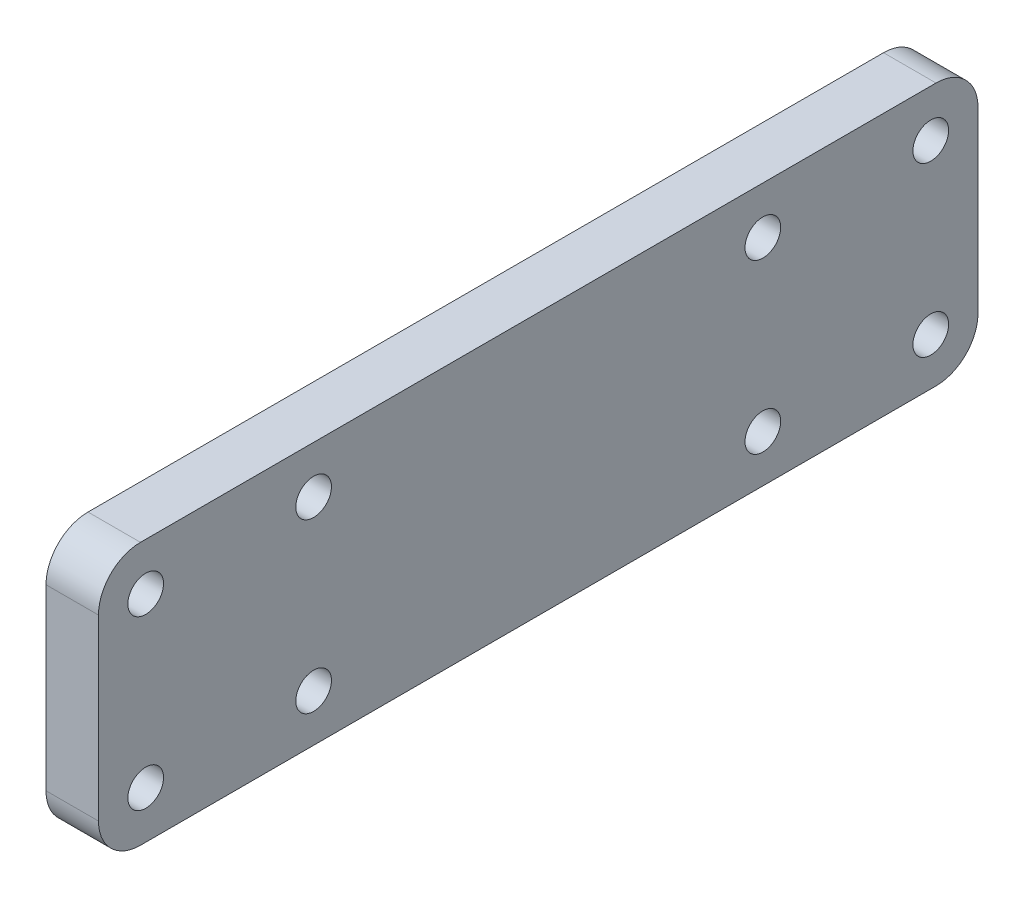
ISO-10303-21;
HEADER;
FILE_DESCRIPTION(('STEP AP214'),'2;1');
FILE_NAME('part.step','',(''),(''),'','','');
FILE_SCHEMA(('AUTOMOTIVE_DESIGN { 1 0 10303 214 1 1 1 1 }'));
ENDSEC;
DATA;
#1=APPLICATION_CONTEXT('core data for automotive mechanical design processes');
#2=APPLICATION_PROTOCOL_DEFINITION('international standard','automotive_design',2000,#1);
#3=PRODUCT_CONTEXT('',#1,'mechanical');
#4=PRODUCT('Part','Part','',(#3));
#5=PRODUCT_RELATED_PRODUCT_CATEGORY('part','',(#4));
#6=PRODUCT_DEFINITION_FORMATION('','',#4);
#7=PRODUCT_DEFINITION_CONTEXT('part definition',#1,'design');
#8=PRODUCT_DEFINITION('design','',#6,#7);
#9=PRODUCT_DEFINITION_SHAPE('','',#8);
#10=(LENGTH_UNIT() NAMED_UNIT(*) SI_UNIT(.MILLI.,.METRE.));
#11=(NAMED_UNIT(*) PLANE_ANGLE_UNIT() SI_UNIT($,.RADIAN.));
#12=(NAMED_UNIT(*) SI_UNIT($,.STERADIAN.) SOLID_ANGLE_UNIT());
#13=UNCERTAINTY_MEASURE_WITH_UNIT(LENGTH_MEASURE(1.E-05),#10,'distance_accuracy_value','');
#14=(GEOMETRIC_REPRESENTATION_CONTEXT(3) GLOBAL_UNCERTAINTY_ASSIGNED_CONTEXT((#13)) GLOBAL_UNIT_ASSIGNED_CONTEXT((#10,
#11,#12)) REPRESENTATION_CONTEXT('',''));
#15=CARTESIAN_POINT('',(0.,0.,0.));
#16=DIRECTION('',(0.,0.,1.));
#17=DIRECTION('',(1.,0.,0.));
#18=AXIS2_PLACEMENT_3D('',#15,#16,#17);
#19=CARTESIAN_POINT('',(5.,12.5,83.80285333));
#20=DIRECTION('',(0.,-1.,0.));
#21=DIRECTION('',(0.,0.,-1.));
#22=AXIS2_PLACEMENT_3D('',#19,#20,#21);
#23=PLANE('',#22);
#24=DIRECTION('',(0.,0.,-1.));
#25=VECTOR('',#24,1.);
#26=CARTESIAN_POINT('',(0.,12.5,83.80285333));
#27=LINE('',#26,#25);
#28=CARTESIAN_POINT('',(0.,12.5,79.80285333));
#29=VERTEX_POINT('',#28);
#30=CARTESIAN_POINT('',(0.,12.5,4.));
#31=VERTEX_POINT('',#30);
#32=EDGE_CURVE('E116',#29,#31,#27,.T.);
#33=ORIENTED_EDGE('',*,*,#32,.F.);
#34=DIRECTION('',(-1.,0.,0.));
#35=VECTOR('',#34,1.);
#36=CARTESIAN_POINT('',(5.,12.5,79.80285333));
#37=LINE('',#36,#35);
#38=CARTESIAN_POINT('',(5.,12.5,79.80285333));
#39=VERTEX_POINT('',#38);
#40=EDGE_CURVE('E102',#29,#39,#37,.F.);
#41=ORIENTED_EDGE('',*,*,#40,.T.);
#42=DIRECTION('',(0.,0.,-1.));
#43=VECTOR('',#42,1.);
#44=CARTESIAN_POINT('',(5.,12.5,83.80285333));
#45=LINE('',#44,#43);
#46=CARTESIAN_POINT('',(5.,12.5,4.));
#47=VERTEX_POINT('',#46);
#48=EDGE_CURVE('E123',#39,#47,#45,.T.);
#49=ORIENTED_EDGE('',*,*,#48,.T.);
#50=DIRECTION('',(-1.,0.,0.));
#51=VECTOR('',#50,1.);
#52=CARTESIAN_POINT('',(5.,12.5,4.));
#53=LINE('',#52,#51);
#54=EDGE_CURVE('E160',#47,#31,#53,.T.);
#55=ORIENTED_EDGE('',*,*,#54,.T.);
#56=EDGE_LOOP('',(#33,#41,#49,#55));
#57=FACE_BOUND('',#56,.T.);
#58=ADVANCED_FACE('F32',(#57),#23,.F.);
#59=CARTESIAN_POINT('',(0.,12.5,83.80285333));
#60=DIRECTION('',(1.,0.,0.));
#61=DIRECTION('',(0.,0.,-1.));
#62=AXIS2_PLACEMENT_3D('',#59,#60,#61);
#63=PLANE('',#62);
#64=CARTESIAN_POINT('',(0.,-8.00000000000001,4.5));
#65=DIRECTION('',(1.,0.,0.));
#66=DIRECTION('',(0.,0.,-1.));
#67=AXIS2_PLACEMENT_3D('',#64,#65,#66);
#68=CIRCLE('',#67,1.7);
#69=CARTESIAN_POINT('',(0.,-8.00000000000001,2.80000000000001));
#70=VERTEX_POINT('',#69);
#71=EDGE_CURVE('E241',#70,#70,#68,.T.);
#72=ORIENTED_EDGE('',*,*,#71,.T.);
#73=EDGE_LOOP('',(#72));
#74=FACE_BOUND('',#73,.T.);
#75=CARTESIAN_POINT('',(0.,8.00000000000001,4.5));
#76=DIRECTION('',(1.,0.,0.));
#77=DIRECTION('',(0.,0.,-1.));
#78=AXIS2_PLACEMENT_3D('',#75,#76,#77);
#79=CIRCLE('',#78,1.7);
#80=CARTESIAN_POINT('',(0.,8.00000000000001,2.80000000000001));
#81=VERTEX_POINT('',#80);
#82=EDGE_CURVE('E251',#81,#81,#79,.T.);
#83=ORIENTED_EDGE('',*,*,#82,.T.);
#84=EDGE_LOOP('',(#83));
#85=FACE_BOUND('',#84,.T.);
#86=CARTESIAN_POINT('',(0.,8.00000000000001,20.5));
#87=DIRECTION('',(1.,0.,0.));
#88=DIRECTION('',(0.,0.,-1.));
#89=AXIS2_PLACEMENT_3D('',#86,#87,#88);
#90=CIRCLE('',#89,1.7);
#91=CARTESIAN_POINT('',(0.,8.00000000000001,18.8));
#92=VERTEX_POINT('',#91);
#93=EDGE_CURVE('E257',#92,#92,#90,.T.);
#94=ORIENTED_EDGE('',*,*,#93,.T.);
#95=EDGE_LOOP('',(#94));
#96=FACE_BOUND('',#95,.T.);
#97=CARTESIAN_POINT('',(0.,8.00000000000001,63.30285333));
#98=DIRECTION('',(1.,0.,0.));
#99=DIRECTION('',(0.,0.,-1.));
#100=AXIS2_PLACEMENT_3D('',#97,#98,#99);
#101=CIRCLE('',#100,1.7);
#102=CARTESIAN_POINT('',(0.,8.00000000000001,61.60285333));
#103=VERTEX_POINT('',#102);
#104=EDGE_CURVE('E263',#103,#103,#101,.T.);
#105=ORIENTED_EDGE('',*,*,#104,.T.);
#106=EDGE_LOOP('',(#105));
#107=FACE_BOUND('',#106,.T.);
#108=CARTESIAN_POINT('',(0.,8.00000000000001,79.30285333));
#109=DIRECTION('',(1.,0.,0.));
#110=DIRECTION('',(0.,0.,-1.));
#111=AXIS2_PLACEMENT_3D('',#108,#109,#110);
#112=CIRCLE('',#111,1.7);
#113=CARTESIAN_POINT('',(0.,8.00000000000001,77.60285333));
#114=VERTEX_POINT('',#113);
#115=EDGE_CURVE('E269',#114,#114,#112,.T.);
#116=ORIENTED_EDGE('',*,*,#115,.T.);
#117=EDGE_LOOP('',(#116));
#118=FACE_BOUND('',#117,.T.);
#119=CARTESIAN_POINT('',(0.,-8.00000000000001,79.30285333));
#120=DIRECTION('',(1.,0.,0.));
#121=DIRECTION('',(0.,0.,-1.));
#122=AXIS2_PLACEMENT_3D('',#119,#120,#121);
#123=CIRCLE('',#122,1.7);
#124=CARTESIAN_POINT('',(0.,-8.00000000000001,77.60285333));
#125=VERTEX_POINT('',#124);
#126=EDGE_CURVE('E275',#125,#125,#123,.T.);
#127=ORIENTED_EDGE('',*,*,#126,.T.);
#128=EDGE_LOOP('',(#127));
#129=FACE_BOUND('',#128,.T.);
#130=CARTESIAN_POINT('',(0.,-8.00000000000001,63.30285333));
#131=DIRECTION('',(1.,0.,0.));
#132=DIRECTION('',(0.,0.,-1.));
#133=AXIS2_PLACEMENT_3D('',#130,#131,#132);
#134=CIRCLE('',#133,1.7);
#135=CARTESIAN_POINT('',(0.,-8.00000000000001,61.60285333));
#136=VERTEX_POINT('',#135);
#137=EDGE_CURVE('E281',#136,#136,#134,.T.);
#138=ORIENTED_EDGE('',*,*,#137,.T.);
#139=EDGE_LOOP('',(#138));
#140=FACE_BOUND('',#139,.T.);
#141=CARTESIAN_POINT('',(0.,-8.00000000000001,20.5));
#142=DIRECTION('',(1.,0.,0.));
#143=DIRECTION('',(0.,0.,-1.));
#144=AXIS2_PLACEMENT_3D('',#141,#142,#143);
#145=CIRCLE('',#144,1.7);
#146=CARTESIAN_POINT('',(0.,-8.00000000000001,18.8));
#147=VERTEX_POINT('',#146);
#148=EDGE_CURVE('E129',#147,#147,#145,.T.);
#149=ORIENTED_EDGE('',*,*,#148,.T.);
#150=EDGE_LOOP('',(#149));
#151=FACE_BOUND('',#150,.T.);
#152=DIRECTION('',(0.,0.,-1.));
#153=VECTOR('',#152,1.);
#154=CARTESIAN_POINT('',(0.,-12.5,83.80285333));
#155=LINE('',#154,#153);
#156=CARTESIAN_POINT('',(0.,-12.5,79.80285333));
#157=VERTEX_POINT('',#156);
#158=CARTESIAN_POINT('',(0.,-12.5,4.));
#159=VERTEX_POINT('',#158);
#160=EDGE_CURVE('E139',#157,#159,#155,.T.);
#161=ORIENTED_EDGE('',*,*,#160,.F.);
#162=CARTESIAN_POINT('',(0.,-8.50000000000001,79.80285333));
#163=DIRECTION('',(1.,0.,0.));
#164=DIRECTION('',(0.,0.,-1.));
#165=AXIS2_PLACEMENT_3D('',#162,#163,#164);
#166=CIRCLE('',#165,4.);
#167=CARTESIAN_POINT('',(0.,-8.50000000000001,83.80285333));
#168=VERTEX_POINT('',#167);
#169=EDGE_CURVE('E103',#157,#168,#166,.F.);
#170=ORIENTED_EDGE('',*,*,#169,.T.);
#171=DIRECTION('',(0.,-1.,0.));
#172=VECTOR('',#171,1.);
#173=CARTESIAN_POINT('',(0.,12.5,83.80285333));
#174=LINE('',#173,#172);
#175=CARTESIAN_POINT('',(0.,8.50000000000001,83.80285333));
#176=VERTEX_POINT('',#175);
#177=EDGE_CURVE('E111',#176,#168,#174,.T.);
#178=ORIENTED_EDGE('',*,*,#177,.F.);
#179=CARTESIAN_POINT('',(0.,8.50000000000001,79.80285333));
#180=DIRECTION('',(1.,0.,0.));
#181=DIRECTION('',(0.,0.,-1.));
#182=AXIS2_PLACEMENT_3D('',#179,#180,#181);
#183=CIRCLE('',#182,4.);
#184=EDGE_CURVE('E55',#176,#29,#183,.F.);
#185=ORIENTED_EDGE('',*,*,#184,.T.);
#186=ORIENTED_EDGE('',*,*,#32,.T.);
#187=CARTESIAN_POINT('',(0.,8.50000000000001,4.));
#188=DIRECTION('',(1.,0.,0.));
#189=DIRECTION('',(0.,0.,-1.));
#190=AXIS2_PLACEMENT_3D('',#187,#188,#189);
#191=CIRCLE('',#190,4.);
#192=CARTESIAN_POINT('',(0.,8.50000000000001,0.));
#193=VERTEX_POINT('',#192);
#194=EDGE_CURVE('E47',#31,#193,#191,.F.);
#195=ORIENTED_EDGE('',*,*,#194,.T.);
#196=DIRECTION('',(0.,-1.,0.));
#197=VECTOR('',#196,1.);
#198=CARTESIAN_POINT('',(0.,12.5,0.));
#199=LINE('',#198,#197);
#200=CARTESIAN_POINT('',(0.,-8.50000000000001,0.));
#201=VERTEX_POINT('',#200);
#202=EDGE_CURVE('E126',#193,#201,#199,.T.);
#203=ORIENTED_EDGE('',*,*,#202,.T.);
#204=CARTESIAN_POINT('',(0.,-8.50000000000001,4.));
#205=DIRECTION('',(1.,0.,0.));
#206=DIRECTION('',(0.,0.,-1.));
#207=AXIS2_PLACEMENT_3D('',#204,#205,#206);
#208=CIRCLE('',#207,4.);
#209=EDGE_CURVE('E104',#201,#159,#208,.F.);
#210=ORIENTED_EDGE('',*,*,#209,.T.);
#211=EDGE_LOOP('',(#161,#170,#178,#185,#186,#195,#203,#210));
#212=FACE_BOUND('',#211,.T.);
#213=ADVANCED_FACE('F119',(#74,#85,#96,#107,#118,#129,#140,#151,#212),#63,.F.);
#214=CARTESIAN_POINT('',(0.,-12.5,83.80285333));
#215=DIRECTION('',(0.,1.,0.));
#216=DIRECTION('',(0.,0.,1.));
#217=AXIS2_PLACEMENT_3D('',#214,#215,#216);
#218=PLANE('',#217);
#219=DIRECTION('',(0.,0.,-1.));
#220=VECTOR('',#219,1.);
#221=CARTESIAN_POINT('',(5.,-12.5,83.80285333));
#222=LINE('',#221,#220);
#223=CARTESIAN_POINT('',(5.,-12.5,79.80285333));
#224=VERTEX_POINT('',#223);
#225=CARTESIAN_POINT('',(5.,-12.5,4.));
#226=VERTEX_POINT('',#225);
#227=EDGE_CURVE('E136',#224,#226,#222,.T.);
#228=ORIENTED_EDGE('',*,*,#227,.F.);
#229=DIRECTION('',(1.,0.,0.));
#230=VECTOR('',#229,1.);
#231=CARTESIAN_POINT('',(0.,-12.5,79.80285333));
#232=LINE('',#231,#230);
#233=EDGE_CURVE('E155',#224,#157,#232,.F.);
#234=ORIENTED_EDGE('',*,*,#233,.T.);
#235=ORIENTED_EDGE('',*,*,#160,.T.);
#236=DIRECTION('',(1.,0.,0.));
#237=VECTOR('',#236,1.);
#238=CARTESIAN_POINT('',(0.,-12.5,4.));
#239=LINE('',#238,#237);
#240=EDGE_CURVE('E152',#159,#226,#239,.T.);
#241=ORIENTED_EDGE('',*,*,#240,.T.);
#242=EDGE_LOOP('',(#228,#234,#235,#241));
#243=FACE_BOUND('',#242,.T.);
#244=ADVANCED_FACE('F178',(#243),#218,.F.);
#245=CARTESIAN_POINT('',(5.,-12.5,83.80285333));
#246=DIRECTION('',(-1.,0.,0.));
#247=DIRECTION('',(0.,0.,1.));
#248=AXIS2_PLACEMENT_3D('',#245,#246,#247);
#249=PLANE('',#248);
#250=CARTESIAN_POINT('',(5.00000000000001,-8.00000000000001,4.5));
#251=DIRECTION('',(1.,0.,0.));
#252=DIRECTION('',(0.,0.,-1.));
#253=AXIS2_PLACEMENT_3D('',#250,#251,#252);
#254=CIRCLE('',#253,1.69999999999999);
#255=CARTESIAN_POINT('',(5.00000000000001,-8.00000000000001,2.80000000000002));
#256=VERTEX_POINT('',#255);
#257=EDGE_CURVE('E244',#256,#256,#254,.T.);
#258=ORIENTED_EDGE('',*,*,#257,.F.);
#259=EDGE_LOOP('',(#258));
#260=FACE_BOUND('',#259,.T.);
#261=CARTESIAN_POINT('',(5.00000000000001,8.00000000000001,4.5));
#262=DIRECTION('',(1.,0.,0.));
#263=DIRECTION('',(0.,0.,-1.));
#264=AXIS2_PLACEMENT_3D('',#261,#262,#263);
#265=CIRCLE('',#264,1.69999999999999);
#266=CARTESIAN_POINT('',(5.00000000000001,8.00000000000001,2.80000000000002));
#267=VERTEX_POINT('',#266);
#268=EDGE_CURVE('E246',#267,#267,#265,.T.);
#269=ORIENTED_EDGE('',*,*,#268,.F.);
#270=EDGE_LOOP('',(#269));
#271=FACE_BOUND('',#270,.T.);
#272=CARTESIAN_POINT('',(5.00000000000001,8.00000000000001,20.5));
#273=DIRECTION('',(1.,0.,0.));
#274=DIRECTION('',(0.,0.,-1.));
#275=AXIS2_PLACEMENT_3D('',#272,#273,#274);
#276=CIRCLE('',#275,1.69999999999999);
#277=CARTESIAN_POINT('',(5.00000000000001,8.00000000000001,18.8));
#278=VERTEX_POINT('',#277);
#279=EDGE_CURVE('E254',#278,#278,#276,.T.);
#280=ORIENTED_EDGE('',*,*,#279,.F.);
#281=EDGE_LOOP('',(#280));
#282=FACE_BOUND('',#281,.T.);
#283=CARTESIAN_POINT('',(5.00000000000001,8.00000000000001,63.30285333));
#284=DIRECTION('',(1.,0.,0.));
#285=DIRECTION('',(0.,0.,-1.));
#286=AXIS2_PLACEMENT_3D('',#283,#284,#285);
#287=CIRCLE('',#286,1.69999999999999);
#288=CARTESIAN_POINT('',(5.00000000000001,8.00000000000001,61.60285333));
#289=VERTEX_POINT('',#288);
#290=EDGE_CURVE('E260',#289,#289,#287,.T.);
#291=ORIENTED_EDGE('',*,*,#290,.F.);
#292=EDGE_LOOP('',(#291));
#293=FACE_BOUND('',#292,.T.);
#294=CARTESIAN_POINT('',(5.00000000000001,8.00000000000001,79.30285333));
#295=DIRECTION('',(1.,0.,0.));
#296=DIRECTION('',(0.,0.,-1.));
#297=AXIS2_PLACEMENT_3D('',#294,#295,#296);
#298=CIRCLE('',#297,1.69999999999999);
#299=CARTESIAN_POINT('',(5.00000000000001,8.00000000000001,77.60285333));
#300=VERTEX_POINT('',#299);
#301=EDGE_CURVE('E266',#300,#300,#298,.T.);
#302=ORIENTED_EDGE('',*,*,#301,.F.);
#303=EDGE_LOOP('',(#302));
#304=FACE_BOUND('',#303,.T.);
#305=CARTESIAN_POINT('',(5.00000000000001,-8.00000000000001,79.30285333));
#306=DIRECTION('',(1.,0.,0.));
#307=DIRECTION('',(0.,0.,-1.));
#308=AXIS2_PLACEMENT_3D('',#305,#306,#307);
#309=CIRCLE('',#308,1.69999999999999);
#310=CARTESIAN_POINT('',(5.00000000000001,-8.00000000000001,77.60285333));
#311=VERTEX_POINT('',#310);
#312=EDGE_CURVE('E272',#311,#311,#309,.T.);
#313=ORIENTED_EDGE('',*,*,#312,.F.);
#314=EDGE_LOOP('',(#313));
#315=FACE_BOUND('',#314,.T.);
#316=CARTESIAN_POINT('',(5.00000000000001,-8.00000000000001,63.30285333));
#317=DIRECTION('',(1.,0.,0.));
#318=DIRECTION('',(0.,0.,-1.));
#319=AXIS2_PLACEMENT_3D('',#316,#317,#318);
#320=CIRCLE('',#319,1.69999999999999);
#321=CARTESIAN_POINT('',(5.00000000000001,-8.00000000000001,61.60285333));
#322=VERTEX_POINT('',#321);
#323=EDGE_CURVE('E278',#322,#322,#320,.T.);
#324=ORIENTED_EDGE('',*,*,#323,.F.);
#325=EDGE_LOOP('',(#324));
#326=FACE_BOUND('',#325,.T.);
#327=CARTESIAN_POINT('',(5.00000000000001,-8.00000000000001,20.5));
#328=DIRECTION('',(1.,0.,0.));
#329=DIRECTION('',(0.,0.,-1.));
#330=AXIS2_PLACEMENT_3D('',#327,#328,#329);
#331=CIRCLE('',#330,1.69999999999999);
#332=CARTESIAN_POINT('',(5.00000000000001,-8.00000000000001,18.8));
#333=VERTEX_POINT('',#332);
#334=EDGE_CURVE('E283',#333,#333,#331,.T.);
#335=ORIENTED_EDGE('',*,*,#334,.F.);
#336=EDGE_LOOP('',(#335));
#337=FACE_BOUND('',#336,.T.);
#338=DIRECTION('',(0.,1.,0.));
#339=VECTOR('',#338,1.);
#340=CARTESIAN_POINT('',(5.,-12.5,83.80285333));
#341=LINE('',#340,#339);
#342=CARTESIAN_POINT('',(5.,-8.50000000000001,83.80285333));
#343=VERTEX_POINT('',#342);
#344=CARTESIAN_POINT('',(5.,8.50000000000001,83.80285333));
#345=VERTEX_POINT('',#344);
#346=EDGE_CURVE('E114',#343,#345,#341,.T.);
#347=ORIENTED_EDGE('',*,*,#346,.F.);
#348=CARTESIAN_POINT('',(5.,-8.50000000000001,79.80285333));
#349=DIRECTION('',(-1.,0.,0.));
#350=DIRECTION('',(0.,0.,1.));
#351=AXIS2_PLACEMENT_3D('',#348,#349,#350);
#352=CIRCLE('',#351,4.);
#353=EDGE_CURVE('E150',#343,#224,#352,.F.);
#354=ORIENTED_EDGE('',*,*,#353,.T.);
#355=ORIENTED_EDGE('',*,*,#227,.T.);
#356=CARTESIAN_POINT('',(5.,-8.50000000000001,4.));
#357=DIRECTION('',(-1.,0.,0.));
#358=DIRECTION('',(0.,0.,1.));
#359=AXIS2_PLACEMENT_3D('',#356,#357,#358);
#360=CIRCLE('',#359,4.);
#361=CARTESIAN_POINT('',(5.,-8.50000000000001,0.));
#362=VERTEX_POINT('',#361);
#363=EDGE_CURVE('E146',#226,#362,#360,.F.);
#364=ORIENTED_EDGE('',*,*,#363,.T.);
#365=DIRECTION('',(0.,1.,0.));
#366=VECTOR('',#365,1.);
#367=CARTESIAN_POINT('',(5.,-12.5,0.));
#368=LINE('',#367,#366);
#369=CARTESIAN_POINT('',(5.,8.50000000000001,0.));
#370=VERTEX_POINT('',#369);
#371=EDGE_CURVE('E121',#362,#370,#368,.T.);
#372=ORIENTED_EDGE('',*,*,#371,.T.);
#373=CARTESIAN_POINT('',(5.,8.50000000000001,4.));
#374=DIRECTION('',(-1.,0.,0.));
#375=DIRECTION('',(0.,0.,1.));
#376=AXIS2_PLACEMENT_3D('',#373,#374,#375);
#377=CIRCLE('',#376,4.);
#378=EDGE_CURVE('E144',#370,#47,#377,.F.);
#379=ORIENTED_EDGE('',*,*,#378,.T.);
#380=ORIENTED_EDGE('',*,*,#48,.F.);
#381=CARTESIAN_POINT('',(5.,8.50000000000001,79.80285333));
#382=DIRECTION('',(-1.,0.,0.));
#383=DIRECTION('',(0.,0.,1.));
#384=AXIS2_PLACEMENT_3D('',#381,#382,#383);
#385=CIRCLE('',#384,4.);
#386=EDGE_CURVE('E148',#39,#345,#385,.F.);
#387=ORIENTED_EDGE('',*,*,#386,.T.);
#388=EDGE_LOOP('',(#347,#354,#355,#364,#372,#379,#380,#387));
#389=FACE_BOUND('',#388,.T.);
#390=ADVANCED_FACE('F169',(#260,#271,#282,#293,#304,#315,#326,#337,#389),#249,.F.);
#391=CARTESIAN_POINT('',(0.,0.,83.80285333));
#392=DIRECTION('',(0.,0.,1.));
#393=DIRECTION('',(1.,0.,0.));
#394=AXIS2_PLACEMENT_3D('',#391,#392,#393);
#395=PLANE('',#394);
#396=ORIENTED_EDGE('',*,*,#177,.T.);
#397=DIRECTION('',(1.,0.,0.));
#398=VECTOR('',#397,1.);
#399=CARTESIAN_POINT('',(5.,-8.50000000000001,83.80285333));
#400=LINE('',#399,#398);
#401=EDGE_CURVE('E115',#168,#343,#400,.T.);
#402=ORIENTED_EDGE('',*,*,#401,.T.);
#403=ORIENTED_EDGE('',*,*,#346,.T.);
#404=DIRECTION('',(-1.,0.,0.));
#405=VECTOR('',#404,1.);
#406=CARTESIAN_POINT('',(0.,8.50000000000001,83.80285333));
#407=LINE('',#406,#405);
#408=EDGE_CURVE('E101',#345,#176,#407,.T.);
#409=ORIENTED_EDGE('',*,*,#408,.T.);
#410=EDGE_LOOP('',(#396,#402,#403,#409));
#411=FACE_BOUND('',#410,.T.);
#412=ADVANCED_FACE('F109',(#411),#395,.T.);
#413=CARTESIAN_POINT('',(0.,0.,0.));
#414=DIRECTION('',(0.,0.,1.));
#415=DIRECTION('',(1.,0.,0.));
#416=AXIS2_PLACEMENT_3D('',#413,#414,#415);
#417=PLANE('',#416);
#418=ORIENTED_EDGE('',*,*,#371,.F.);
#419=DIRECTION('',(1.,0.,0.));
#420=VECTOR('',#419,1.);
#421=CARTESIAN_POINT('',(0.,-8.50000000000001,0.));
#422=LINE('',#421,#420);
#423=EDGE_CURVE('E11',#362,#201,#422,.F.);
#424=ORIENTED_EDGE('',*,*,#423,.T.);
#425=ORIENTED_EDGE('',*,*,#202,.F.);
#426=DIRECTION('',(-1.,0.,0.));
#427=VECTOR('',#426,1.);
#428=CARTESIAN_POINT('',(0.,8.50000000000001,0.));
#429=LINE('',#428,#427);
#430=EDGE_CURVE('E40',#193,#370,#429,.F.);
#431=ORIENTED_EDGE('',*,*,#430,.T.);
#432=EDGE_LOOP('',(#418,#424,#425,#431));
#433=FACE_BOUND('',#432,.T.);
#434=ADVANCED_FACE('F165',(#433),#417,.F.);
#435=CARTESIAN_POINT('',(0.,-8.50000000000001,79.80285333));
#436=DIRECTION('',(-1.,0.,0.));
#437=DIRECTION('',(0.,0.,1.));
#438=AXIS2_PLACEMENT_3D('',#435,#436,#437);
#439=CYLINDRICAL_SURFACE('',#438,4.);
#440=ORIENTED_EDGE('',*,*,#169,.F.);
#441=ORIENTED_EDGE('',*,*,#233,.F.);
#442=ORIENTED_EDGE('',*,*,#353,.F.);
#443=ORIENTED_EDGE('',*,*,#401,.F.);
#444=EDGE_LOOP('',(#440,#441,#442,#443));
#445=FACE_BOUND('',#444,.T.);
#446=ADVANCED_FACE('F181',(#445),#439,.T.);
#447=CARTESIAN_POINT('',(0.,8.50000000000001,79.80285333));
#448=DIRECTION('',(1.,0.,0.));
#449=DIRECTION('',(0.,0.,-1.));
#450=AXIS2_PLACEMENT_3D('',#447,#448,#449);
#451=CYLINDRICAL_SURFACE('',#450,4.);
#452=ORIENTED_EDGE('',*,*,#386,.F.);
#453=ORIENTED_EDGE('',*,*,#40,.F.);
#454=ORIENTED_EDGE('',*,*,#184,.F.);
#455=ORIENTED_EDGE('',*,*,#408,.F.);
#456=EDGE_LOOP('',(#452,#453,#454,#455));
#457=FACE_BOUND('',#456,.T.);
#458=ADVANCED_FACE('F100',(#457),#451,.T.);
#459=CARTESIAN_POINT('',(0.,-8.50000000000001,4.));
#460=DIRECTION('',(1.,0.,0.));
#461=DIRECTION('',(0.,0.,-1.));
#462=AXIS2_PLACEMENT_3D('',#459,#460,#461);
#463=CYLINDRICAL_SURFACE('',#462,4.);
#464=ORIENTED_EDGE('',*,*,#209,.F.);
#465=ORIENTED_EDGE('',*,*,#423,.F.);
#466=ORIENTED_EDGE('',*,*,#363,.F.);
#467=ORIENTED_EDGE('',*,*,#240,.F.);
#468=EDGE_LOOP('',(#464,#465,#466,#467));
#469=FACE_BOUND('',#468,.T.);
#470=ADVANCED_FACE('F175',(#469),#463,.T.);
#471=CARTESIAN_POINT('',(5.,8.50000000000001,4.));
#472=DIRECTION('',(-1.,0.,0.));
#473=DIRECTION('',(0.,0.,1.));
#474=AXIS2_PLACEMENT_3D('',#471,#472,#473);
#475=CYLINDRICAL_SURFACE('',#474,4.);
#476=ORIENTED_EDGE('',*,*,#378,.F.);
#477=ORIENTED_EDGE('',*,*,#430,.F.);
#478=ORIENTED_EDGE('',*,*,#194,.F.);
#479=ORIENTED_EDGE('',*,*,#54,.F.);
#480=EDGE_LOOP('',(#476,#477,#478,#479));
#481=FACE_BOUND('',#480,.T.);
#482=ADVANCED_FACE('F34',(#481),#475,.T.);
#483=CARTESIAN_POINT('',(5.,-8.00000000000001,20.5));
#484=DIRECTION('',(1.,0.,0.));
#485=DIRECTION('',(0.,0.,-1.));
#486=AXIS2_PLACEMENT_3D('',#483,#484,#485);
#487=CYLINDRICAL_SURFACE('',#486,1.69999999999999);
#488=ORIENTED_EDGE('',*,*,#148,.F.);
#489=EDGE_LOOP('',(#488));
#490=FACE_BOUND('',#489,.T.);
#491=ORIENTED_EDGE('',*,*,#334,.T.);
#492=EDGE_LOOP('',(#491));
#493=FACE_BOUND('',#492,.T.);
#494=ADVANCED_FACE('F205',(#490,#493),#487,.F.);
#495=CARTESIAN_POINT('',(5.,-8.00000000000001,63.30285333));
#496=DIRECTION('',(1.,0.,0.));
#497=DIRECTION('',(0.,0.,-1.));
#498=AXIS2_PLACEMENT_3D('',#495,#496,#497);
#499=CYLINDRICAL_SURFACE('',#498,1.69999999999999);
#500=ORIENTED_EDGE('',*,*,#137,.F.);
#501=EDGE_LOOP('',(#500));
#502=FACE_BOUND('',#501,.T.);
#503=ORIENTED_EDGE('',*,*,#323,.T.);
#504=EDGE_LOOP('',(#503));
#505=FACE_BOUND('',#504,.T.);
#506=ADVANCED_FACE('F208',(#502,#505),#499,.F.);
#507=CARTESIAN_POINT('',(5.,-8.00000000000001,79.30285333));
#508=DIRECTION('',(1.,0.,0.));
#509=DIRECTION('',(0.,0.,-1.));
#510=AXIS2_PLACEMENT_3D('',#507,#508,#509);
#511=CYLINDRICAL_SURFACE('',#510,1.69999999999999);
#512=ORIENTED_EDGE('',*,*,#126,.F.);
#513=EDGE_LOOP('',(#512));
#514=FACE_BOUND('',#513,.T.);
#515=ORIENTED_EDGE('',*,*,#312,.T.);
#516=EDGE_LOOP('',(#515));
#517=FACE_BOUND('',#516,.T.);
#518=ADVANCED_FACE('F212',(#514,#517),#511,.F.);
#519=CARTESIAN_POINT('',(5.,8.00000000000001,79.30285333));
#520=DIRECTION('',(1.,0.,0.));
#521=DIRECTION('',(0.,0.,-1.));
#522=AXIS2_PLACEMENT_3D('',#519,#520,#521);
#523=CYLINDRICAL_SURFACE('',#522,1.69999999999999);
#524=ORIENTED_EDGE('',*,*,#115,.F.);
#525=EDGE_LOOP('',(#524));
#526=FACE_BOUND('',#525,.T.);
#527=ORIENTED_EDGE('',*,*,#301,.T.);
#528=EDGE_LOOP('',(#527));
#529=FACE_BOUND('',#528,.T.);
#530=ADVANCED_FACE('F216',(#526,#529),#523,.F.);
#531=CARTESIAN_POINT('',(5.,8.00000000000001,63.30285333));
#532=DIRECTION('',(1.,0.,0.));
#533=DIRECTION('',(0.,0.,-1.));
#534=AXIS2_PLACEMENT_3D('',#531,#532,#533);
#535=CYLINDRICAL_SURFACE('',#534,1.69999999999999);
#536=ORIENTED_EDGE('',*,*,#104,.F.);
#537=EDGE_LOOP('',(#536));
#538=FACE_BOUND('',#537,.T.);
#539=ORIENTED_EDGE('',*,*,#290,.T.);
#540=EDGE_LOOP('',(#539));
#541=FACE_BOUND('',#540,.T.);
#542=ADVANCED_FACE('F220',(#538,#541),#535,.F.);
#543=CARTESIAN_POINT('',(5.,8.00000000000001,20.5));
#544=DIRECTION('',(1.,0.,0.));
#545=DIRECTION('',(0.,0.,-1.));
#546=AXIS2_PLACEMENT_3D('',#543,#544,#545);
#547=CYLINDRICAL_SURFACE('',#546,1.69999999999999);
#548=ORIENTED_EDGE('',*,*,#93,.F.);
#549=EDGE_LOOP('',(#548));
#550=FACE_BOUND('',#549,.T.);
#551=ORIENTED_EDGE('',*,*,#279,.T.);
#552=EDGE_LOOP('',(#551));
#553=FACE_BOUND('',#552,.T.);
#554=ADVANCED_FACE('F224',(#550,#553),#547,.F.);
#555=CARTESIAN_POINT('',(5.,8.00000000000001,4.5));
#556=DIRECTION('',(1.,0.,0.));
#557=DIRECTION('',(0.,0.,-1.));
#558=AXIS2_PLACEMENT_3D('',#555,#556,#557);
#559=CYLINDRICAL_SURFACE('',#558,1.69999999999999);
#560=ORIENTED_EDGE('',*,*,#82,.F.);
#561=EDGE_LOOP('',(#560));
#562=FACE_BOUND('',#561,.T.);
#563=ORIENTED_EDGE('',*,*,#268,.T.);
#564=EDGE_LOOP('',(#563));
#565=FACE_BOUND('',#564,.T.);
#566=ADVANCED_FACE('F228',(#562,#565),#559,.F.);
#567=CARTESIAN_POINT('',(5.,-8.00000000000001,4.5));
#568=DIRECTION('',(1.,0.,0.));
#569=DIRECTION('',(0.,0.,-1.));
#570=AXIS2_PLACEMENT_3D('',#567,#568,#569);
#571=CYLINDRICAL_SURFACE('',#570,1.69999999999999);
#572=ORIENTED_EDGE('',*,*,#71,.F.);
#573=EDGE_LOOP('',(#572));
#574=FACE_BOUND('',#573,.T.);
#575=ORIENTED_EDGE('',*,*,#257,.T.);
#576=EDGE_LOOP('',(#575));
#577=FACE_BOUND('',#576,.T.);
#578=ADVANCED_FACE('F232',(#574,#577),#571,.F.);
#579=CLOSED_SHELL('',(#58,#213,#244,#390,#412,#434,#446,#458,#470,#482,#494,#506,#518,#530,#542,
#554,#566,#578));
#580=MANIFOLD_SOLID_BREP('B2',#579);
#581=ADVANCED_BREP_SHAPE_REPRESENTATION('',(#18,#580),#14);
#582=SHAPE_DEFINITION_REPRESENTATION(#9,#581);
ENDSEC;
END-ISO-10303-21;
